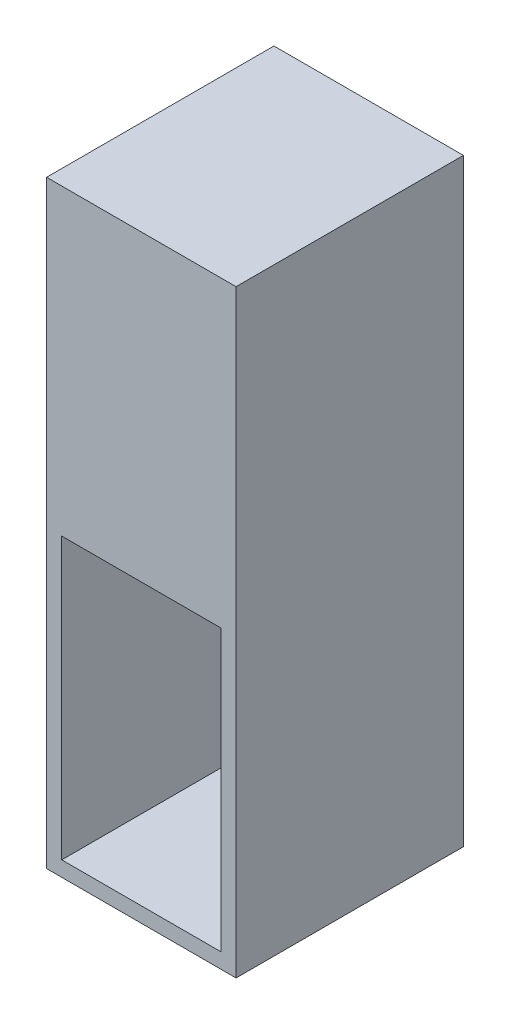
ISO-10303-21;
HEADER;
FILE_DESCRIPTION(('STEP AP214'),'2;1');
FILE_NAME('part.step','',(''),(''),'','','');
FILE_SCHEMA(('AUTOMOTIVE_DESIGN { 1 0 10303 214 1 1 1 1 }'));
ENDSEC;
DATA;
#1=APPLICATION_CONTEXT('core data for automotive mechanical design processes');
#2=APPLICATION_PROTOCOL_DEFINITION('international standard','automotive_design',2000,#1);
#3=PRODUCT_CONTEXT('',#1,'mechanical');
#4=PRODUCT('Part','Part','',(#3));
#5=PRODUCT_RELATED_PRODUCT_CATEGORY('part','',(#4));
#6=PRODUCT_DEFINITION_FORMATION('','',#4);
#7=PRODUCT_DEFINITION_CONTEXT('part definition',#1,'design');
#8=PRODUCT_DEFINITION('design','',#6,#7);
#9=PRODUCT_DEFINITION_SHAPE('','',#8);
#10=(LENGTH_UNIT() NAMED_UNIT(*) SI_UNIT(.MILLI.,.METRE.));
#11=(NAMED_UNIT(*) PLANE_ANGLE_UNIT() SI_UNIT($,.RADIAN.));
#12=(NAMED_UNIT(*) SI_UNIT($,.STERADIAN.) SOLID_ANGLE_UNIT());
#13=UNCERTAINTY_MEASURE_WITH_UNIT(LENGTH_MEASURE(1.E-05),#10,'distance_accuracy_value','');
#14=(GEOMETRIC_REPRESENTATION_CONTEXT(3) GLOBAL_UNCERTAINTY_ASSIGNED_CONTEXT((#13)) GLOBAL_UNIT_ASSIGNED_CONTEXT((#10,
#11,#12)) REPRESENTATION_CONTEXT('',''));
#15=CARTESIAN_POINT('',(0.,0.,0.));
#16=DIRECTION('',(0.,0.,1.));
#17=DIRECTION('',(1.,0.,0.));
#18=AXIS2_PLACEMENT_3D('',#15,#16,#17);
#19=CARTESIAN_POINT('',(-89.376286082279,55.4681775466775,30.));
#20=DIRECTION('',(1.,0.,0.));
#21=DIRECTION('',(0.,1.,0.));
#22=AXIS2_PLACEMENT_3D('',#19,#20,#21);
#23=PLANE('',#22);
#24=DIRECTION('',(0.,-1.,0.));
#25=VECTOR('',#24,1.);
#26=CARTESIAN_POINT('',(-89.376286082279,55.4681775466775,0.));
#27=LINE('',#26,#25);
#28=CARTESIAN_POINT('',(-89.376286082279,55.4681775466775,0.));
#29=VERTEX_POINT('',#28);
#30=CARTESIAN_POINT('',(-89.376286082279,-23.5318224533225,0.));
#31=VERTEX_POINT('',#30);
#32=EDGE_CURVE('E129',#29,#31,#27,.T.);
#33=ORIENTED_EDGE('',*,*,#32,.T.);
#34=DIRECTION('',(0.,0.,-1.));
#35=VECTOR('',#34,1.);
#36=CARTESIAN_POINT('',(-89.376286082279,-23.5318224533225,30.));
#37=LINE('',#36,#35);
#38=CARTESIAN_POINT('',(-89.376286082279,-23.5318224533225,30.));
#39=VERTEX_POINT('',#38);
#40=EDGE_CURVE('E11',#39,#31,#37,.T.);
#41=ORIENTED_EDGE('',*,*,#40,.F.);
#42=DIRECTION('',(0.,-1.,0.));
#43=VECTOR('',#42,1.);
#44=CARTESIAN_POINT('',(-89.376286082279,55.4681775466775,30.));
#45=LINE('',#44,#43);
#46=CARTESIAN_POINT('',(-89.376286082279,55.4681775466775,30.));
#47=VERTEX_POINT('',#46);
#48=EDGE_CURVE('E133',#47,#39,#45,.T.);
#49=ORIENTED_EDGE('',*,*,#48,.F.);
#50=DIRECTION('',(0.,0.,-1.));
#51=VECTOR('',#50,1.);
#52=CARTESIAN_POINT('',(-89.376286082279,55.4681775466775,30.));
#53=LINE('',#52,#51);
#54=EDGE_CURVE('E143',#47,#29,#53,.T.);
#55=ORIENTED_EDGE('',*,*,#54,.T.);
#56=EDGE_LOOP('',(#33,#41,#49,#55));
#57=FACE_BOUND('',#56,.T.);
#58=ADVANCED_FACE('F32',(#57),#23,.F.);
#59=CARTESIAN_POINT('',(-89.376286082279,-23.5318224533225,30.));
#60=DIRECTION('',(0.,1.,0.));
#61=DIRECTION('',(0.,0.,1.));
#62=AXIS2_PLACEMENT_3D('',#59,#60,#61);
#63=PLANE('',#62);
#64=DIRECTION('',(1.,0.,0.));
#65=VECTOR('',#64,1.);
#66=CARTESIAN_POINT('',(-89.376286082279,-23.5318224533225,0.));
#67=LINE('',#66,#65);
#68=CARTESIAN_POINT('',(-64.376286082279,-23.5318224533225,0.));
#69=VERTEX_POINT('',#68);
#70=EDGE_CURVE('E146',#31,#69,#67,.T.);
#71=ORIENTED_EDGE('',*,*,#70,.T.);
#72=DIRECTION('',(0.,0.,-1.));
#73=VECTOR('',#72,1.);
#74=CARTESIAN_POINT('',(-64.376286082279,-23.5318224533225,30.));
#75=LINE('',#74,#73);
#76=CARTESIAN_POINT('',(-64.376286082279,-23.5318224533225,30.));
#77=VERTEX_POINT('',#76);
#78=EDGE_CURVE('E39',#77,#69,#75,.T.);
#79=ORIENTED_EDGE('',*,*,#78,.F.);
#80=DIRECTION('',(1.,0.,0.));
#81=VECTOR('',#80,1.);
#82=CARTESIAN_POINT('',(-89.376286082279,-23.5318224533225,30.));
#83=LINE('',#82,#81);
#84=EDGE_CURVE('E136',#39,#77,#83,.T.);
#85=ORIENTED_EDGE('',*,*,#84,.F.);
#86=ORIENTED_EDGE('',*,*,#40,.T.);
#87=EDGE_LOOP('',(#71,#79,#85,#86));
#88=FACE_BOUND('',#87,.T.);
#89=ADVANCED_FACE('F174',(#88),#63,.F.);
#90=CARTESIAN_POINT('',(-64.376286082279,55.4681775466775,30.));
#91=DIRECTION('',(-1.,0.,0.));
#92=DIRECTION('',(0.,-1.,0.));
#93=AXIS2_PLACEMENT_3D('',#90,#91,#92);
#94=PLANE('',#93);
#95=DIRECTION('',(0.,1.,0.));
#96=VECTOR('',#95,1.);
#97=CARTESIAN_POINT('',(-64.376286082279,55.4681775466775,0.));
#98=LINE('',#97,#96);
#99=CARTESIAN_POINT('',(-64.376286082279,55.4681775466775,0.));
#100=VERTEX_POINT('',#99);
#101=EDGE_CURVE('E148',#69,#100,#98,.T.);
#102=ORIENTED_EDGE('',*,*,#101,.T.);
#103=DIRECTION('',(0.,0.,-1.));
#104=VECTOR('',#103,1.);
#105=CARTESIAN_POINT('',(-64.376286082279,55.4681775466775,30.));
#106=LINE('',#105,#104);
#107=CARTESIAN_POINT('',(-64.376286082279,55.4681775466775,30.));
#108=VERTEX_POINT('',#107);
#109=EDGE_CURVE('E153',#108,#100,#106,.T.);
#110=ORIENTED_EDGE('',*,*,#109,.F.);
#111=DIRECTION('',(0.,1.,0.));
#112=VECTOR('',#111,1.);
#113=CARTESIAN_POINT('',(-64.376286082279,55.4681775466775,30.));
#114=LINE('',#113,#112);
#115=EDGE_CURVE('E139',#77,#108,#114,.T.);
#116=ORIENTED_EDGE('',*,*,#115,.F.);
#117=ORIENTED_EDGE('',*,*,#78,.T.);
#118=EDGE_LOOP('',(#102,#110,#116,#117));
#119=FACE_BOUND('',#118,.T.);
#120=ADVANCED_FACE('F160',(#119),#94,.F.);
#121=CARTESIAN_POINT('',(-89.376286082279,55.4681775466775,30.));
#122=DIRECTION('',(0.,-1.,0.));
#123=DIRECTION('',(0.,0.,-1.));
#124=AXIS2_PLACEMENT_3D('',#121,#122,#123);
#125=PLANE('',#124);
#126=DIRECTION('',(-1.,0.,0.));
#127=VECTOR('',#126,1.);
#128=CARTESIAN_POINT('',(-89.376286082279,55.4681775466775,0.));
#129=LINE('',#128,#127);
#130=EDGE_CURVE('E137',#100,#29,#129,.T.);
#131=ORIENTED_EDGE('',*,*,#130,.T.);
#132=ORIENTED_EDGE('',*,*,#54,.F.);
#133=DIRECTION('',(-1.,0.,0.));
#134=VECTOR('',#133,1.);
#135=CARTESIAN_POINT('',(-89.376286082279,55.4681775466775,30.));
#136=LINE('',#135,#134);
#137=EDGE_CURVE('E141',#108,#47,#136,.T.);
#138=ORIENTED_EDGE('',*,*,#137,.F.);
#139=ORIENTED_EDGE('',*,*,#109,.T.);
#140=EDGE_LOOP('',(#131,#132,#138,#139));
#141=FACE_BOUND('',#140,.T.);
#142=ADVANCED_FACE('F167',(#141),#125,.F.);
#143=CARTESIAN_POINT('',(0.,0.,30.));
#144=DIRECTION('',(0.,0.,1.));
#145=DIRECTION('',(1.,0.,0.));
#146=AXIS2_PLACEMENT_3D('',#143,#144,#145);
#147=PLANE('',#146);
#148=DIRECTION('',(0.,-1.,0.));
#149=VECTOR('',#148,1.);
#150=CARTESIAN_POINT('',(-87.376286082279,-21.5318224533225,30.));
#151=LINE('',#150,#149);
#152=CARTESIAN_POINT('',(-87.376286082279,15.4681775466775,30.));
#153=VERTEX_POINT('',#152);
#154=CARTESIAN_POINT('',(-87.376286082279,-21.5318224533225,30.));
#155=VERTEX_POINT('',#154);
#156=EDGE_CURVE('E46',#153,#155,#151,.T.);
#157=ORIENTED_EDGE('',*,*,#156,.F.);
#158=DIRECTION('',(-1.,0.,0.));
#159=VECTOR('',#158,1.);
#160=CARTESIAN_POINT('',(-87.376286082279,15.4681775466775,30.));
#161=LINE('',#160,#159);
#162=CARTESIAN_POINT('',(-66.376286082279,15.4681775466775,30.));
#163=VERTEX_POINT('',#162);
#164=EDGE_CURVE('E114',#163,#153,#161,.T.);
#165=ORIENTED_EDGE('',*,*,#164,.F.);
#166=DIRECTION('',(0.,1.,0.));
#167=VECTOR('',#166,1.);
#168=CARTESIAN_POINT('',(-66.376286082279,-21.5318224533225,30.));
#169=LINE('',#168,#167);
#170=CARTESIAN_POINT('',(-66.376286082279,-21.5318224533225,30.));
#171=VERTEX_POINT('',#170);
#172=EDGE_CURVE('E117',#171,#163,#169,.T.);
#173=ORIENTED_EDGE('',*,*,#172,.F.);
#174=DIRECTION('',(1.,0.,0.));
#175=VECTOR('',#174,1.);
#176=CARTESIAN_POINT('',(-87.376286082279,-21.5318224533225,30.));
#177=LINE('',#176,#175);
#178=EDGE_CURVE('E123',#155,#171,#177,.T.);
#179=ORIENTED_EDGE('',*,*,#178,.F.);
#180=EDGE_LOOP('',(#157,#165,#173,#179));
#181=FACE_BOUND('',#180,.T.);
#182=ORIENTED_EDGE('',*,*,#48,.T.);
#183=ORIENTED_EDGE('',*,*,#84,.T.);
#184=ORIENTED_EDGE('',*,*,#115,.T.);
#185=ORIENTED_EDGE('',*,*,#137,.T.);
#186=EDGE_LOOP('',(#182,#183,#184,#185));
#187=FACE_BOUND('',#186,.T.);
#188=ADVANCED_FACE('F173',(#181,#187),#147,.T.);
#189=CARTESIAN_POINT('',(0.,0.,0.));
#190=DIRECTION('',(0.,0.,1.));
#191=DIRECTION('',(1.,0.,0.));
#192=AXIS2_PLACEMENT_3D('',#189,#190,#191);
#193=PLANE('',#192);
#194=DIRECTION('',(-1.,0.,0.));
#195=VECTOR('',#194,1.);
#196=CARTESIAN_POINT('',(-87.376286082279,15.4681775466775,0.));
#197=LINE('',#196,#195);
#198=CARTESIAN_POINT('',(-66.376286082279,15.4681775466775,0.));
#199=VERTEX_POINT('',#198);
#200=CARTESIAN_POINT('',(-87.376286082279,15.4681775466775,0.));
#201=VERTEX_POINT('',#200);
#202=EDGE_CURVE('E104',#199,#201,#197,.T.);
#203=ORIENTED_EDGE('',*,*,#202,.T.);
#204=DIRECTION('',(0.,-1.,0.));
#205=VECTOR('',#204,1.);
#206=CARTESIAN_POINT('',(-87.376286082279,-21.5318224533225,0.));
#207=LINE('',#206,#205);
#208=CARTESIAN_POINT('',(-87.376286082279,-21.5318224533225,0.));
#209=VERTEX_POINT('',#208);
#210=EDGE_CURVE('E98',#201,#209,#207,.T.);
#211=ORIENTED_EDGE('',*,*,#210,.T.);
#212=DIRECTION('',(1.,0.,0.));
#213=VECTOR('',#212,1.);
#214=CARTESIAN_POINT('',(-87.376286082279,-21.5318224533225,0.));
#215=LINE('',#214,#213);
#216=CARTESIAN_POINT('',(-66.376286082279,-21.5318224533225,0.));
#217=VERTEX_POINT('',#216);
#218=EDGE_CURVE('E107',#209,#217,#215,.T.);
#219=ORIENTED_EDGE('',*,*,#218,.T.);
#220=DIRECTION('',(0.,1.,0.));
#221=VECTOR('',#220,1.);
#222=CARTESIAN_POINT('',(-66.376286082279,-21.5318224533225,0.));
#223=LINE('',#222,#221);
#224=EDGE_CURVE('E54',#217,#199,#223,.T.);
#225=ORIENTED_EDGE('',*,*,#224,.T.);
#226=EDGE_LOOP('',(#203,#211,#219,#225));
#227=FACE_BOUND('',#226,.T.);
#228=ORIENTED_EDGE('',*,*,#32,.F.);
#229=ORIENTED_EDGE('',*,*,#130,.F.);
#230=ORIENTED_EDGE('',*,*,#101,.F.);
#231=ORIENTED_EDGE('',*,*,#70,.F.);
#232=EDGE_LOOP('',(#228,#229,#230,#231));
#233=FACE_BOUND('',#232,.T.);
#234=ADVANCED_FACE('F111',(#227,#233),#193,.F.);
#235=CARTESIAN_POINT('',(-87.376286082279,-21.5318224533225,0.));
#236=DIRECTION('',(-1.,0.,0.));
#237=DIRECTION('',(0.,0.,1.));
#238=AXIS2_PLACEMENT_3D('',#235,#236,#237);
#239=PLANE('',#238);
#240=ORIENTED_EDGE('',*,*,#156,.T.);
#241=DIRECTION('',(0.,0.,1.));
#242=VECTOR('',#241,1.);
#243=CARTESIAN_POINT('',(-87.376286082279,-21.5318224533225,0.));
#244=LINE('',#243,#242);
#245=EDGE_CURVE('E94',#209,#155,#244,.T.);
#246=ORIENTED_EDGE('',*,*,#245,.F.);
#247=ORIENTED_EDGE('',*,*,#210,.F.);
#248=DIRECTION('',(0.,0.,1.));
#249=VECTOR('',#248,1.);
#250=CARTESIAN_POINT('',(-87.376286082279,15.4681775466775,0.));
#251=LINE('',#250,#249);
#252=EDGE_CURVE('E127',#201,#153,#251,.T.);
#253=ORIENTED_EDGE('',*,*,#252,.T.);
#254=EDGE_LOOP('',(#240,#246,#247,#253));
#255=FACE_BOUND('',#254,.T.);
#256=ADVANCED_FACE('F96',(#255),#239,.F.);
#257=CARTESIAN_POINT('',(-87.376286082279,15.4681775466775,0.));
#258=DIRECTION('',(0.,1.,0.));
#259=DIRECTION('',(0.,0.,1.));
#260=AXIS2_PLACEMENT_3D('',#257,#258,#259);
#261=PLANE('',#260);
#262=ORIENTED_EDGE('',*,*,#164,.T.);
#263=ORIENTED_EDGE('',*,*,#252,.F.);
#264=ORIENTED_EDGE('',*,*,#202,.F.);
#265=DIRECTION('',(0.,0.,1.));
#266=VECTOR('',#265,1.);
#267=CARTESIAN_POINT('',(-66.376286082279,15.4681775466775,0.));
#268=LINE('',#267,#266);
#269=EDGE_CURVE('E130',#199,#163,#268,.T.);
#270=ORIENTED_EDGE('',*,*,#269,.T.);
#271=EDGE_LOOP('',(#262,#263,#264,#270));
#272=FACE_BOUND('',#271,.T.);
#273=ADVANCED_FACE('F191',(#272),#261,.F.);
#274=CARTESIAN_POINT('',(-66.376286082279,-21.5318224533225,0.));
#275=DIRECTION('',(1.,0.,0.));
#276=DIRECTION('',(0.,0.,-1.));
#277=AXIS2_PLACEMENT_3D('',#274,#275,#276);
#278=PLANE('',#277);
#279=ORIENTED_EDGE('',*,*,#172,.T.);
#280=ORIENTED_EDGE('',*,*,#269,.F.);
#281=ORIENTED_EDGE('',*,*,#224,.F.);
#282=DIRECTION('',(0.,0.,1.));
#283=VECTOR('',#282,1.);
#284=CARTESIAN_POINT('',(-66.376286082279,-21.5318224533225,0.));
#285=LINE('',#284,#283);
#286=EDGE_CURVE('E103',#217,#171,#285,.T.);
#287=ORIENTED_EDGE('',*,*,#286,.T.);
#288=EDGE_LOOP('',(#279,#280,#281,#287));
#289=FACE_BOUND('',#288,.T.);
#290=ADVANCED_FACE('F194',(#289),#278,.F.);
#291=CARTESIAN_POINT('',(-87.376286082279,-21.5318224533225,0.));
#292=DIRECTION('',(0.,-1.,0.));
#293=DIRECTION('',(0.,0.,-1.));
#294=AXIS2_PLACEMENT_3D('',#291,#292,#293);
#295=PLANE('',#294);
#296=ORIENTED_EDGE('',*,*,#178,.T.);
#297=ORIENTED_EDGE('',*,*,#286,.F.);
#298=ORIENTED_EDGE('',*,*,#218,.F.);
#299=ORIENTED_EDGE('',*,*,#245,.T.);
#300=EDGE_LOOP('',(#296,#297,#298,#299));
#301=FACE_BOUND('',#300,.T.);
#302=ADVANCED_FACE('F108',(#301),#295,.F.);
#303=CLOSED_SHELL('',(#58,#89,#120,#142,#188,#234,#256,#273,#290,#302));
#304=MANIFOLD_SOLID_BREP('B2',#303);
#305=ADVANCED_BREP_SHAPE_REPRESENTATION('',(#18,#304),#14);
#306=SHAPE_DEFINITION_REPRESENTATION(#9,#305);
ENDSEC;
END-ISO-10303-21;
